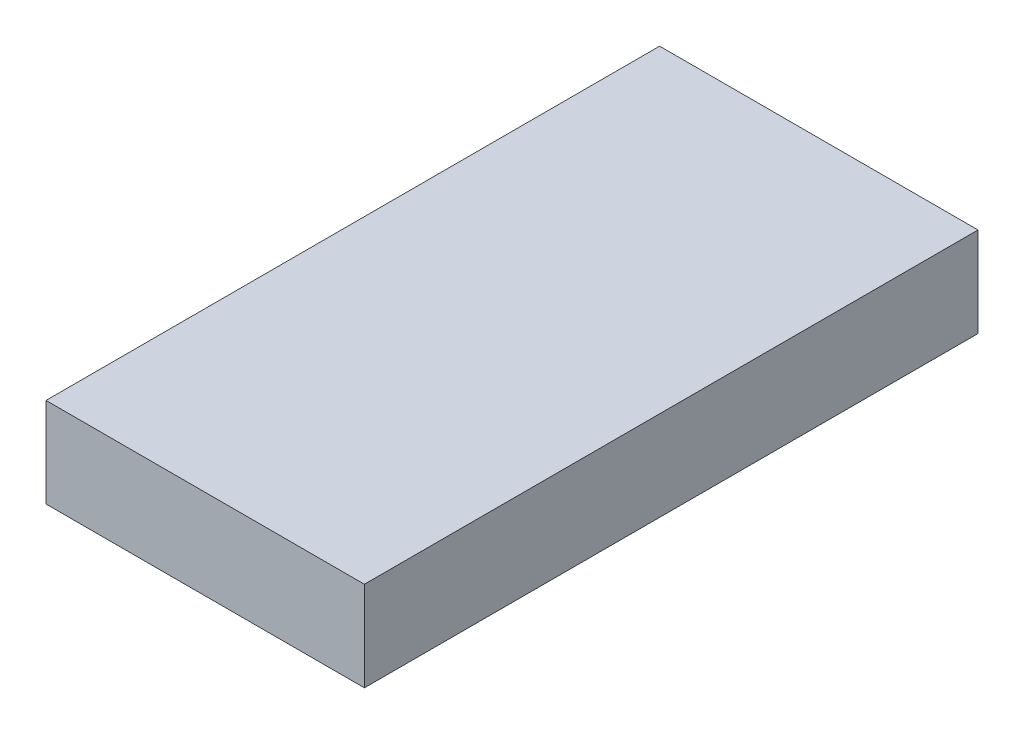
ISO-10303-21;
HEADER;
FILE_DESCRIPTION(('STEP AP214'),'2;1');
FILE_NAME('part.step','',(''),(''),'','','');
FILE_SCHEMA(('AUTOMOTIVE_DESIGN { 1 0 10303 214 1 1 1 1 }'));
ENDSEC;
DATA;
#1=APPLICATION_CONTEXT('core data for automotive mechanical design processes');
#2=APPLICATION_PROTOCOL_DEFINITION('international standard','automotive_design',2000,#1);
#3=PRODUCT_CONTEXT('',#1,'mechanical');
#4=PRODUCT('Part','Part','',(#3));
#5=PRODUCT_RELATED_PRODUCT_CATEGORY('part','',(#4));
#6=PRODUCT_DEFINITION_FORMATION('','',#4);
#7=PRODUCT_DEFINITION_CONTEXT('part definition',#1,'design');
#8=PRODUCT_DEFINITION('design','',#6,#7);
#9=PRODUCT_DEFINITION_SHAPE('','',#8);
#10=(LENGTH_UNIT() NAMED_UNIT(*) SI_UNIT(.MILLI.,.METRE.));
#11=(NAMED_UNIT(*) PLANE_ANGLE_UNIT() SI_UNIT($,.RADIAN.));
#12=(NAMED_UNIT(*) SI_UNIT($,.STERADIAN.) SOLID_ANGLE_UNIT());
#13=UNCERTAINTY_MEASURE_WITH_UNIT(LENGTH_MEASURE(1.E-05),#10,'distance_accuracy_value','');
#14=(GEOMETRIC_REPRESENTATION_CONTEXT(3) GLOBAL_UNCERTAINTY_ASSIGNED_CONTEXT((#13)) GLOBAL_UNIT_ASSIGNED_CONTEXT((#10,
#11,#12)) REPRESENTATION_CONTEXT('',''));
#15=CARTESIAN_POINT('',(0.,0.,0.));
#16=DIRECTION('',(0.,0.,1.));
#17=DIRECTION('',(1.,0.,0.));
#18=AXIS2_PLACEMENT_3D('',#15,#16,#17);
#19=CARTESIAN_POINT('',(22.,12.4,42.4));
#20=DIRECTION('',(-1.,0.,0.));
#21=DIRECTION('',(0.,0.,1.));
#22=AXIS2_PLACEMENT_3D('',#19,#20,#21);
#23=PLANE('',#22);
#24=DIRECTION('',(0.,0.,-1.));
#25=VECTOR('',#24,1.);
#26=CARTESIAN_POINT('',(22.,0.,42.4));
#27=LINE('',#26,#25);
#28=CARTESIAN_POINT('',(22.,0.,42.4));
#29=VERTEX_POINT('',#28);
#30=CARTESIAN_POINT('',(22.,0.,-42.4));
#31=VERTEX_POINT('',#30);
#32=EDGE_CURVE('E113',#29,#31,#27,.T.);
#33=ORIENTED_EDGE('',*,*,#32,.T.);
#34=DIRECTION('',(0.,-1.,0.));
#35=VECTOR('',#34,1.);
#36=CARTESIAN_POINT('',(22.,12.4,-42.4));
#37=LINE('',#36,#35);
#38=CARTESIAN_POINT('',(22.,12.4,-42.4));
#39=VERTEX_POINT('',#38);
#40=EDGE_CURVE('E11',#39,#31,#37,.T.);
#41=ORIENTED_EDGE('',*,*,#40,.F.);
#42=DIRECTION('',(0.,0.,-1.));
#43=VECTOR('',#42,1.);
#44=CARTESIAN_POINT('',(22.,12.4,42.4));
#45=LINE('',#44,#43);
#46=CARTESIAN_POINT('',(22.,12.4,42.4));
#47=VERTEX_POINT('',#46);
#48=EDGE_CURVE('E97',#47,#39,#45,.T.);
#49=ORIENTED_EDGE('',*,*,#48,.F.);
#50=DIRECTION('',(0.,-1.,0.));
#51=VECTOR('',#50,1.);
#52=CARTESIAN_POINT('',(22.,12.4,42.4));
#53=LINE('',#52,#51);
#54=EDGE_CURVE('E109',#47,#29,#53,.T.);
#55=ORIENTED_EDGE('',*,*,#54,.T.);
#56=EDGE_LOOP('',(#33,#41,#49,#55));
#57=FACE_BOUND('',#56,.T.);
#58=ADVANCED_FACE('F45',(#57),#23,.F.);
#59=CARTESIAN_POINT('',(-22.,12.4,-42.4));
#60=DIRECTION('',(0.,0.,1.));
#61=DIRECTION('',(1.,0.,0.));
#62=AXIS2_PLACEMENT_3D('',#59,#60,#61);
#63=PLANE('',#62);
#64=DIRECTION('',(-1.,0.,0.));
#65=VECTOR('',#64,1.);
#66=CARTESIAN_POINT('',(-22.,0.,-42.4));
#67=LINE('',#66,#65);
#68=CARTESIAN_POINT('',(-22.,0.,-42.4));
#69=VERTEX_POINT('',#68);
#70=EDGE_CURVE('E102',#31,#69,#67,.T.);
#71=ORIENTED_EDGE('',*,*,#70,.T.);
#72=DIRECTION('',(0.,-1.,0.));
#73=VECTOR('',#72,1.);
#74=CARTESIAN_POINT('',(-22.,12.4,-42.4));
#75=LINE('',#74,#73);
#76=CARTESIAN_POINT('',(-22.,12.4,-42.4));
#77=VERTEX_POINT('',#76);
#78=EDGE_CURVE('E54',#77,#69,#75,.T.);
#79=ORIENTED_EDGE('',*,*,#78,.F.);
#80=DIRECTION('',(-1.,0.,0.));
#81=VECTOR('',#80,1.);
#82=CARTESIAN_POINT('',(-22.,12.4,-42.4));
#83=LINE('',#82,#81);
#84=EDGE_CURVE('E92',#39,#77,#83,.T.);
#85=ORIENTED_EDGE('',*,*,#84,.F.);
#86=ORIENTED_EDGE('',*,*,#40,.T.);
#87=EDGE_LOOP('',(#71,#79,#85,#86));
#88=FACE_BOUND('',#87,.T.);
#89=ADVANCED_FACE('F101',(#88),#63,.F.);
#90=CARTESIAN_POINT('',(-22.,12.4,42.4));
#91=DIRECTION('',(1.,0.,0.));
#92=DIRECTION('',(0.,0.,-1.));
#93=AXIS2_PLACEMENT_3D('',#90,#91,#92);
#94=PLANE('',#93);
#95=DIRECTION('',(0.,0.,1.));
#96=VECTOR('',#95,1.);
#97=CARTESIAN_POINT('',(-22.,0.,42.4));
#98=LINE('',#97,#96);
#99=CARTESIAN_POINT('',(-22.,0.,42.4));
#100=VERTEX_POINT('',#99);
#101=EDGE_CURVE('E79',#69,#100,#98,.T.);
#102=ORIENTED_EDGE('',*,*,#101,.T.);
#103=DIRECTION('',(0.,-1.,0.));
#104=VECTOR('',#103,1.);
#105=CARTESIAN_POINT('',(-22.,12.4,42.4));
#106=LINE('',#105,#104);
#107=CARTESIAN_POINT('',(-22.,12.4,42.4));
#108=VERTEX_POINT('',#107);
#109=EDGE_CURVE('E104',#108,#100,#106,.T.);
#110=ORIENTED_EDGE('',*,*,#109,.F.);
#111=DIRECTION('',(0.,0.,1.));
#112=VECTOR('',#111,1.);
#113=CARTESIAN_POINT('',(-22.,12.4,42.4));
#114=LINE('',#113,#112);
#115=EDGE_CURVE('E95',#77,#108,#114,.T.);
#116=ORIENTED_EDGE('',*,*,#115,.F.);
#117=ORIENTED_EDGE('',*,*,#78,.T.);
#118=EDGE_LOOP('',(#102,#110,#116,#117));
#119=FACE_BOUND('',#118,.T.);
#120=ADVANCED_FACE('F105',(#119),#94,.F.);
#121=CARTESIAN_POINT('',(-22.,12.4,42.4));
#122=DIRECTION('',(0.,0.,-1.));
#123=DIRECTION('',(-1.,0.,0.));
#124=AXIS2_PLACEMENT_3D('',#121,#122,#123);
#125=PLANE('',#124);
#126=DIRECTION('',(1.,0.,0.));
#127=VECTOR('',#126,1.);
#128=CARTESIAN_POINT('',(-22.,0.,42.4));
#129=LINE('',#128,#127);
#130=EDGE_CURVE('E85',#100,#29,#129,.T.);
#131=ORIENTED_EDGE('',*,*,#130,.T.);
#132=ORIENTED_EDGE('',*,*,#54,.F.);
#133=DIRECTION('',(1.,0.,0.));
#134=VECTOR('',#133,1.);
#135=CARTESIAN_POINT('',(-22.,12.4,42.4));
#136=LINE('',#135,#134);
#137=EDGE_CURVE('E62',#108,#47,#136,.T.);
#138=ORIENTED_EDGE('',*,*,#137,.F.);
#139=ORIENTED_EDGE('',*,*,#109,.T.);
#140=EDGE_LOOP('',(#131,#132,#138,#139));
#141=FACE_BOUND('',#140,.T.);
#142=ADVANCED_FACE('F126',(#141),#125,.F.);
#143=CARTESIAN_POINT('',(0.,12.4,0.));
#144=DIRECTION('',(0.,-1.,0.));
#145=DIRECTION('',(0.,0.,-1.));
#146=AXIS2_PLACEMENT_3D('',#143,#144,#145);
#147=PLANE('',#146);
#148=ORIENTED_EDGE('',*,*,#48,.T.);
#149=ORIENTED_EDGE('',*,*,#84,.T.);
#150=ORIENTED_EDGE('',*,*,#115,.T.);
#151=ORIENTED_EDGE('',*,*,#137,.T.);
#152=EDGE_LOOP('',(#148,#149,#150,#151));
#153=FACE_BOUND('',#152,.T.);
#154=ADVANCED_FACE('F93',(#153),#147,.F.);
#155=CARTESIAN_POINT('',(0.,0.,0.));
#156=DIRECTION('',(0.,-1.,0.));
#157=DIRECTION('',(0.,0.,-1.));
#158=AXIS2_PLACEMENT_3D('',#155,#156,#157);
#159=PLANE('',#158);
#160=ORIENTED_EDGE('',*,*,#32,.F.);
#161=ORIENTED_EDGE('',*,*,#130,.F.);
#162=ORIENTED_EDGE('',*,*,#101,.F.);
#163=ORIENTED_EDGE('',*,*,#70,.F.);
#164=EDGE_LOOP('',(#160,#161,#162,#163));
#165=FACE_BOUND('',#164,.T.);
#166=ADVANCED_FACE('F129',(#165),#159,.T.);
#167=CLOSED_SHELL('',(#58,#89,#120,#142,#154,#166));
#168=MANIFOLD_SOLID_BREP('B2',#167);
#169=ADVANCED_BREP_SHAPE_REPRESENTATION('',(#18,#168),#14);
#170=SHAPE_DEFINITION_REPRESENTATION(#9,#169);
ENDSEC;
END-ISO-10303-21;
